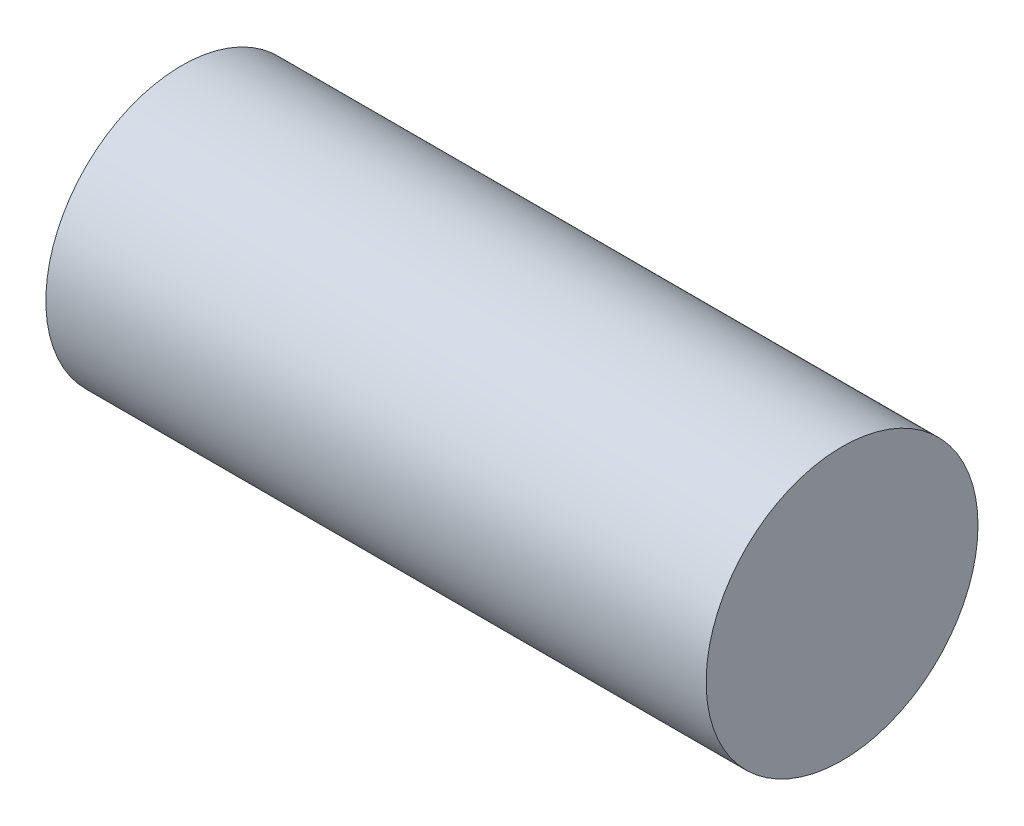
ISO-10303-21;
HEADER;
FILE_DESCRIPTION(('STEP AP214'),'2;1');
FILE_NAME('part.step','',(''),(''),'','','');
FILE_SCHEMA(('AUTOMOTIVE_DESIGN { 1 0 10303 214 1 1 1 1 }'));
ENDSEC;
DATA;
#1=APPLICATION_CONTEXT('core data for automotive mechanical design processes');
#2=APPLICATION_PROTOCOL_DEFINITION('international standard','automotive_design',2000,#1);
#3=PRODUCT_CONTEXT('',#1,'mechanical');
#4=PRODUCT('Part','Part','',(#3));
#5=PRODUCT_RELATED_PRODUCT_CATEGORY('part','',(#4));
#6=PRODUCT_DEFINITION_FORMATION('','',#4);
#7=PRODUCT_DEFINITION_CONTEXT('part definition',#1,'design');
#8=PRODUCT_DEFINITION('design','',#6,#7);
#9=PRODUCT_DEFINITION_SHAPE('','',#8);
#10=(LENGTH_UNIT() NAMED_UNIT(*) SI_UNIT(.MILLI.,.METRE.));
#11=(NAMED_UNIT(*) PLANE_ANGLE_UNIT() SI_UNIT($,.RADIAN.));
#12=(NAMED_UNIT(*) SI_UNIT($,.STERADIAN.) SOLID_ANGLE_UNIT());
#13=UNCERTAINTY_MEASURE_WITH_UNIT(LENGTH_MEASURE(1.E-05),#10,'distance_accuracy_value','');
#14=(GEOMETRIC_REPRESENTATION_CONTEXT(3) GLOBAL_UNCERTAINTY_ASSIGNED_CONTEXT((#13)) GLOBAL_UNIT_ASSIGNED_CONTEXT((#10,
#11,#12)) REPRESENTATION_CONTEXT('',''));
#15=CARTESIAN_POINT('',(0.,0.,0.));
#16=DIRECTION('',(0.,0.,1.));
#17=DIRECTION('',(1.,0.,0.));
#18=AXIS2_PLACEMENT_3D('',#15,#16,#17);
#19=CARTESIAN_POINT('',(4.25,0.,0.));
#20=DIRECTION('',(-1.,0.,0.));
#21=DIRECTION('',(0.,0.,1.));
#22=AXIS2_PLACEMENT_3D('',#19,#20,#21);
#23=CYLINDRICAL_SURFACE('',#22,1.75);
#24=CARTESIAN_POINT('',(4.25,0.,0.));
#25=DIRECTION('',(1.,0.,0.));
#26=DIRECTION('',(0.,0.,-1.));
#27=AXIS2_PLACEMENT_3D('',#24,#25,#26);
#28=CIRCLE('',#27,1.75);
#29=CARTESIAN_POINT('',(4.25,0.,-1.75));
#30=VERTEX_POINT('',#29);
#31=EDGE_CURVE('E10',#30,#30,#28,.T.);
#32=ORIENTED_EDGE('',*,*,#31,.F.);
#33=EDGE_LOOP('',(#32));
#34=FACE_BOUND('',#33,.T.);
#35=CARTESIAN_POINT('',(-4.25,0.,0.));
#36=DIRECTION('',(1.,0.,0.));
#37=DIRECTION('',(0.,0.,-1.));
#38=AXIS2_PLACEMENT_3D('',#35,#36,#37);
#39=CIRCLE('',#38,1.75);
#40=CARTESIAN_POINT('',(-4.25,0.,-1.75));
#41=VERTEX_POINT('',#40);
#42=EDGE_CURVE('E40',#41,#41,#39,.T.);
#43=ORIENTED_EDGE('',*,*,#42,.T.);
#44=EDGE_LOOP('',(#43));
#45=FACE_BOUND('',#44,.T.);
#46=ADVANCED_FACE('F37',(#34,#45),#23,.T.);
#47=CARTESIAN_POINT('',(4.25,0.,0.));
#48=DIRECTION('',(1.,0.,0.));
#49=DIRECTION('',(0.,0.,-1.));
#50=AXIS2_PLACEMENT_3D('',#47,#48,#49);
#51=PLANE('',#50);
#52=ORIENTED_EDGE('',*,*,#31,.T.);
#53=EDGE_LOOP('',(#52));
#54=FACE_BOUND('',#53,.T.);
#55=ADVANCED_FACE('F52',(#54),#51,.T.);
#56=CARTESIAN_POINT('',(-4.25,0.,0.));
#57=DIRECTION('',(1.,0.,0.));
#58=DIRECTION('',(0.,0.,-1.));
#59=AXIS2_PLACEMENT_3D('',#56,#57,#58);
#60=PLANE('',#59);
#61=ORIENTED_EDGE('',*,*,#42,.F.);
#62=EDGE_LOOP('',(#61));
#63=FACE_BOUND('',#62,.T.);
#64=ADVANCED_FACE('F50',(#63),#60,.F.);
#65=CLOSED_SHELL('',(#46,#55,#64));
#66=MANIFOLD_SOLID_BREP('B2',#65);
#67=ADVANCED_BREP_SHAPE_REPRESENTATION('',(#18,#66),#14);
#68=SHAPE_DEFINITION_REPRESENTATION(#9,#67);
ENDSEC;
END-ISO-10303-21;
